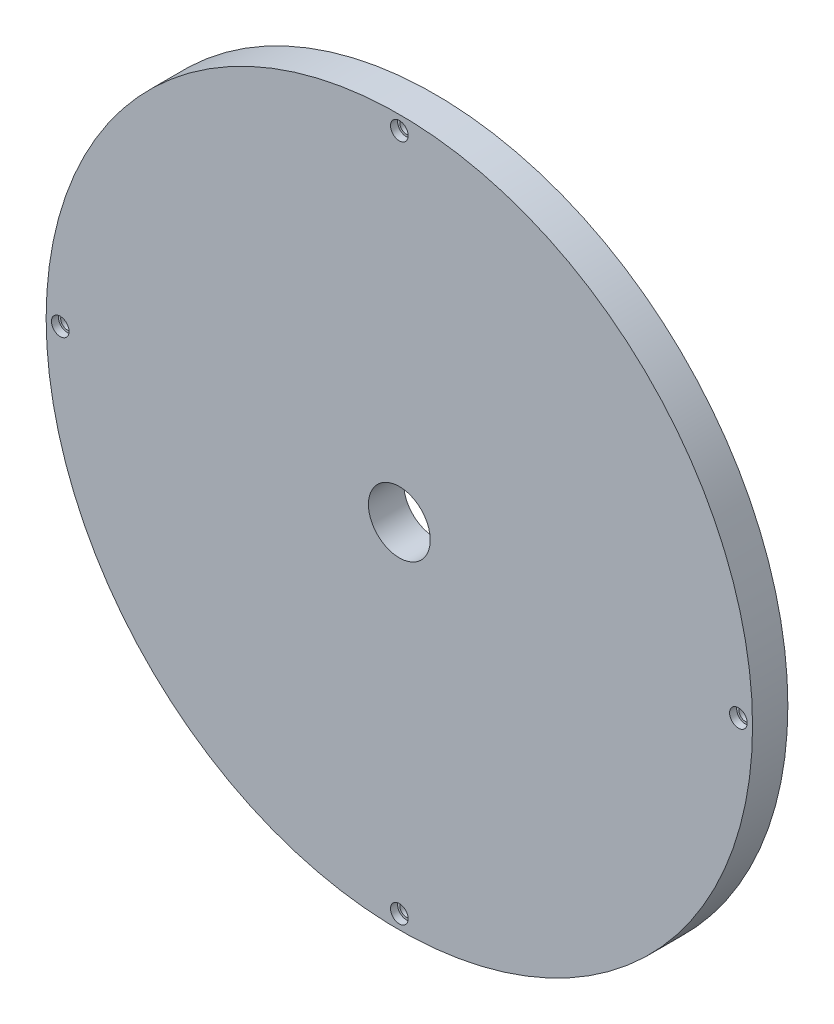
ISO-10303-21;
HEADER;
FILE_DESCRIPTION(('STEP AP214'),'2;1');
FILE_NAME('part.step','',(''),(''),'','','');
FILE_SCHEMA(('AUTOMOTIVE_DESIGN { 1 0 10303 214 1 1 1 1 }'));
ENDSEC;
DATA;
#1=APPLICATION_CONTEXT('core data for automotive mechanical design processes');
#2=APPLICATION_PROTOCOL_DEFINITION('international standard','automotive_design',2000,#1);
#3=PRODUCT_CONTEXT('',#1,'mechanical');
#4=PRODUCT('Part','Part','',(#3));
#5=PRODUCT_RELATED_PRODUCT_CATEGORY('part','',(#4));
#6=PRODUCT_DEFINITION_FORMATION('','',#4);
#7=PRODUCT_DEFINITION_CONTEXT('part definition',#1,'design');
#8=PRODUCT_DEFINITION('design','',#6,#7);
#9=PRODUCT_DEFINITION_SHAPE('','',#8);
#10=(LENGTH_UNIT() NAMED_UNIT(*) SI_UNIT(.MILLI.,.METRE.));
#11=(NAMED_UNIT(*) PLANE_ANGLE_UNIT() SI_UNIT($,.RADIAN.));
#12=(NAMED_UNIT(*) SI_UNIT($,.STERADIAN.) SOLID_ANGLE_UNIT());
#13=UNCERTAINTY_MEASURE_WITH_UNIT(LENGTH_MEASURE(1.E-05),#10,'distance_accuracy_value','');
#14=(GEOMETRIC_REPRESENTATION_CONTEXT(3) GLOBAL_UNCERTAINTY_ASSIGNED_CONTEXT((#13)) GLOBAL_UNIT_ASSIGNED_CONTEXT((#10,
#11,#12)) REPRESENTATION_CONTEXT('',''));
#15=CARTESIAN_POINT('',(0.,0.,0.));
#16=DIRECTION('',(0.,0.,1.));
#17=DIRECTION('',(1.,0.,0.));
#18=AXIS2_PLACEMENT_3D('',#15,#16,#17);
#19=CARTESIAN_POINT('',(-60.9600000000017,1.72512195998983E-12,6.35));
#20=DIRECTION('',(0.,0.,-1.));
#21=DIRECTION('',(-1.,0.,0.));
#22=AXIS2_PLACEMENT_3D('',#19,#20,#21);
#23=CYLINDRICAL_SURFACE('',#22,1.19062500000135);
#24=CARTESIAN_POINT('',(-60.9600000000017,1.72512195998983E-12,0.));
#25=DIRECTION('',(0.,0.,-1.));
#26=DIRECTION('',(-1.,0.,0.));
#27=AXIS2_PLACEMENT_3D('',#24,#25,#26);
#28=CIRCLE('',#27,1.19062500000135);
#29=CARTESIAN_POINT('',(-62.1506250000031,1.72512195998983E-12,0.));
#30=VERTEX_POINT('',#29);
#31=EDGE_CURVE('E89',#30,#30,#28,.T.);
#32=ORIENTED_EDGE('',*,*,#31,.T.);
#33=EDGE_LOOP('',(#32));
#34=FACE_BOUND('',#33,.T.);
#35=CARTESIAN_POINT('',(-60.9600000000017,1.72512195998983E-12,5.08));
#36=DIRECTION('',(0.,0.,1.));
#37=DIRECTION('',(1.,0.,0.));
#38=AXIS2_PLACEMENT_3D('',#35,#36,#37);
#39=CIRCLE('',#38,1.19062500000135);
#40=CARTESIAN_POINT('',(-59.7693750000004,1.72512195998983E-12,5.08));
#41=VERTEX_POINT('',#40);
#42=EDGE_CURVE('E35',#41,#41,#39,.F.);
#43=ORIENTED_EDGE('',*,*,#42,.F.);
#44=EDGE_LOOP('',(#43));
#45=FACE_BOUND('',#44,.T.);
#46=ADVANCED_FACE('F31',(#34,#45),#23,.F.);
#47=CARTESIAN_POINT('',(-3.45024391997965E-12,-60.96,6.35));
#48=DIRECTION('',(0.,0.,-1.));
#49=DIRECTION('',(-1.,0.,0.));
#50=AXIS2_PLACEMENT_3D('',#47,#48,#49);
#51=CYLINDRICAL_SURFACE('',#50,1.19062500000371);
#52=CARTESIAN_POINT('',(-3.45024391997965E-12,-60.96,0.));
#53=DIRECTION('',(0.,0.,-1.));
#54=DIRECTION('',(-1.,0.,0.));
#55=AXIS2_PLACEMENT_3D('',#52,#53,#54);
#56=CIRCLE('',#55,1.19062500000371);
#57=CARTESIAN_POINT('',(-1.19062500000716,-60.96,0.));
#58=VERTEX_POINT('',#57);
#59=EDGE_CURVE('E86',#58,#58,#56,.T.);
#60=ORIENTED_EDGE('',*,*,#59,.T.);
#61=EDGE_LOOP('',(#60));
#62=FACE_BOUND('',#61,.T.);
#63=CARTESIAN_POINT('',(-3.45024391997965E-12,-60.96,5.08));
#64=DIRECTION('',(0.,0.,1.));
#65=DIRECTION('',(1.,0.,0.));
#66=AXIS2_PLACEMENT_3D('',#63,#64,#65);
#67=CIRCLE('',#66,1.19062500000371);
#68=CARTESIAN_POINT('',(1.19062500000026,-60.96,5.08));
#69=VERTEX_POINT('',#68);
#70=EDGE_CURVE('E59',#69,#69,#67,.F.);
#71=ORIENTED_EDGE('',*,*,#70,.F.);
#72=EDGE_LOOP('',(#71));
#73=FACE_BOUND('',#72,.T.);
#74=ADVANCED_FACE('F129',(#62,#73),#51,.F.);
#75=CARTESIAN_POINT('',(60.9599999999983,-1.73258740687743E-12,6.35));
#76=DIRECTION('',(0.,0.,-1.));
#77=DIRECTION('',(-1.,0.,0.));
#78=AXIS2_PLACEMENT_3D('',#75,#76,#77);
#79=CYLINDRICAL_SURFACE('',#78,1.19062500000277);
#80=CARTESIAN_POINT('',(60.9599999999983,-1.73258740687743E-12,0.));
#81=DIRECTION('',(0.,0.,-1.));
#82=DIRECTION('',(-1.,0.,0.));
#83=AXIS2_PLACEMENT_3D('',#80,#81,#82);
#84=CIRCLE('',#83,1.19062500000277);
#85=CARTESIAN_POINT('',(59.7693749999955,-1.73258740687743E-12,0.));
#86=VERTEX_POINT('',#85);
#87=EDGE_CURVE('E53',#86,#86,#84,.T.);
#88=ORIENTED_EDGE('',*,*,#87,.T.);
#89=EDGE_LOOP('',(#88));
#90=FACE_BOUND('',#89,.T.);
#91=CARTESIAN_POINT('',(60.9599999999983,-1.73258740687743E-12,5.08));
#92=DIRECTION('',(0.,0.,1.));
#93=DIRECTION('',(1.,0.,0.));
#94=AXIS2_PLACEMENT_3D('',#91,#92,#93);
#95=CIRCLE('',#94,1.19062500000277);
#96=CARTESIAN_POINT('',(62.150625000001,-1.73258740687743E-12,5.08));
#97=VERTEX_POINT('',#96);
#98=EDGE_CURVE('E55',#97,#97,#95,.F.);
#99=ORIENTED_EDGE('',*,*,#98,.F.);
#100=EDGE_LOOP('',(#99));
#101=FACE_BOUND('',#100,.T.);
#102=ADVANCED_FACE('F125',(#90,#101),#79,.F.);
#103=CARTESIAN_POINT('',(0.,60.96,6.35));
#104=DIRECTION('',(0.,0.,-1.));
#105=DIRECTION('',(-1.,0.,0.));
#106=AXIS2_PLACEMENT_3D('',#103,#104,#105);
#107=CYLINDRICAL_SURFACE('',#106,1.190625);
#108=CARTESIAN_POINT('',(0.,60.96,0.));
#109=DIRECTION('',(0.,0.,-1.));
#110=DIRECTION('',(-1.,0.,0.));
#111=AXIS2_PLACEMENT_3D('',#108,#109,#110);
#112=CIRCLE('',#111,1.190625);
#113=CARTESIAN_POINT('',(-1.190625,60.96,0.));
#114=VERTEX_POINT('',#113);
#115=EDGE_CURVE('E92',#114,#114,#112,.T.);
#116=ORIENTED_EDGE('',*,*,#115,.T.);
#117=EDGE_LOOP('',(#116));
#118=FACE_BOUND('',#117,.T.);
#119=CARTESIAN_POINT('',(0.,60.96,5.08));
#120=DIRECTION('',(0.,0.,1.));
#121=DIRECTION('',(1.,0.,0.));
#122=AXIS2_PLACEMENT_3D('',#119,#120,#121);
#123=CIRCLE('',#122,1.190625);
#124=CARTESIAN_POINT('',(1.190625,60.96,5.08));
#125=VERTEX_POINT('',#124);
#126=EDGE_CURVE('E50',#125,#125,#123,.F.);
#127=ORIENTED_EDGE('',*,*,#126,.F.);
#128=EDGE_LOOP('',(#127));
#129=FACE_BOUND('',#128,.T.);
#130=ADVANCED_FACE('F117',(#118,#129),#107,.F.);
#131=CARTESIAN_POINT('',(0.,0.,6.35));
#132=DIRECTION('',(0.,0.,-1.));
#133=DIRECTION('',(-1.,0.,0.));
#134=AXIS2_PLACEMENT_3D('',#131,#132,#133);
#135=CYLINDRICAL_SURFACE('',#134,63.5);
#136=CARTESIAN_POINT('',(0.,0.,6.35));
#137=DIRECTION('',(0.,0.,1.));
#138=DIRECTION('',(1.,0.,0.));
#139=AXIS2_PLACEMENT_3D('',#136,#137,#138);
#140=CIRCLE('',#139,63.5);
#141=CARTESIAN_POINT('',(63.5,0.,6.35));
#142=VERTEX_POINT('',#141);
#143=EDGE_CURVE('E10',#142,#142,#140,.T.);
#144=ORIENTED_EDGE('',*,*,#143,.F.);
#145=EDGE_LOOP('',(#144));
#146=FACE_BOUND('',#145,.T.);
#147=CARTESIAN_POINT('',(0.,0.,0.));
#148=DIRECTION('',(0.,0.,1.));
#149=DIRECTION('',(1.,0.,0.));
#150=AXIS2_PLACEMENT_3D('',#147,#148,#149);
#151=CIRCLE('',#150,63.5);
#152=CARTESIAN_POINT('',(63.5,0.,0.));
#153=VERTEX_POINT('',#152);
#154=EDGE_CURVE('E39',#153,#153,#151,.T.);
#155=ORIENTED_EDGE('',*,*,#154,.T.);
#156=EDGE_LOOP('',(#155));
#157=FACE_BOUND('',#156,.T.);
#158=ADVANCED_FACE('F33',(#146,#157),#135,.T.);
#159=CARTESIAN_POINT('',(0.,0.,6.35));
#160=DIRECTION('',(0.,0.,1.));
#161=DIRECTION('',(1.,0.,0.));
#162=AXIS2_PLACEMENT_3D('',#159,#160,#161);
#163=PLANE('',#162);
#164=CARTESIAN_POINT('',(0.,0.,6.35));
#165=DIRECTION('',(0.,0.,-1.));
#166=DIRECTION('',(-1.,0.,0.));
#167=AXIS2_PLACEMENT_3D('',#164,#165,#166);
#168=CIRCLE('',#167,5.55625);
#169=CARTESIAN_POINT('',(-5.55625,0.,6.35));
#170=VERTEX_POINT('',#169);
#171=EDGE_CURVE('E322',#170,#170,#168,.T.);
#172=ORIENTED_EDGE('',*,*,#171,.T.);
#173=EDGE_LOOP('',(#172));
#174=FACE_BOUND('',#173,.T.);
#175=CARTESIAN_POINT('',(-60.9599999999983,-1.73258740687743E-12,6.35));
#176=DIRECTION('',(0.,0.,1.));
#177=DIRECTION('',(1.,0.,0.));
#178=AXIS2_PLACEMENT_3D('',#175,#176,#177);
#179=CIRCLE('',#178,1.58750000000277);
#180=CARTESIAN_POINT('',(-59.3724999999955,-1.73258740687743E-12,6.35));
#181=VERTEX_POINT('',#180);
#182=EDGE_CURVE('E75',#181,#181,#179,.T.);
#183=ORIENTED_EDGE('',*,*,#182,.F.);
#184=EDGE_LOOP('',(#183));
#185=FACE_BOUND('',#184,.T.);
#186=CARTESIAN_POINT('',(3.45024391997965E-12,-60.96,6.35));
#187=DIRECTION('',(0.,0.,1.));
#188=DIRECTION('',(1.,0.,0.));
#189=AXIS2_PLACEMENT_3D('',#186,#187,#188);
#190=CIRCLE('',#189,1.5875000000037);
#191=CARTESIAN_POINT('',(1.58750000000716,-60.96,6.35));
#192=VERTEX_POINT('',#191);
#193=EDGE_CURVE('E68',#192,#192,#190,.T.);
#194=ORIENTED_EDGE('',*,*,#193,.F.);
#195=EDGE_LOOP('',(#194));
#196=FACE_BOUND('',#195,.T.);
#197=CARTESIAN_POINT('',(60.9600000000017,1.72512195998983E-12,6.35));
#198=DIRECTION('',(0.,0.,1.));
#199=DIRECTION('',(1.,0.,0.));
#200=AXIS2_PLACEMENT_3D('',#197,#198,#199);
#201=CIRCLE('',#200,1.58750000000135);
#202=CARTESIAN_POINT('',(62.5475000000031,1.72512195998983E-12,6.35));
#203=VERTEX_POINT('',#202);
#204=EDGE_CURVE('E61',#203,#203,#201,.T.);
#205=ORIENTED_EDGE('',*,*,#204,.F.);
#206=EDGE_LOOP('',(#205));
#207=FACE_BOUND('',#206,.T.);
#208=CARTESIAN_POINT('',(0.,60.96,6.35));
#209=DIRECTION('',(0.,0.,1.));
#210=DIRECTION('',(1.,0.,0.));
#211=AXIS2_PLACEMENT_3D('',#208,#209,#210);
#212=CIRCLE('',#211,1.5875);
#213=CARTESIAN_POINT('',(1.5875,60.96,6.35));
#214=VERTEX_POINT('',#213);
#215=EDGE_CURVE('E57',#214,#214,#212,.T.);
#216=ORIENTED_EDGE('',*,*,#215,.F.);
#217=EDGE_LOOP('',(#216));
#218=FACE_BOUND('',#217,.T.);
#219=ORIENTED_EDGE('',*,*,#143,.T.);
#220=EDGE_LOOP('',(#219));
#221=FACE_BOUND('',#220,.T.);
#222=ADVANCED_FACE('F111',(#174,#185,#196,#207,#218,#221),#163,.T.);
#223=CARTESIAN_POINT('',(0.,0.,0.));
#224=DIRECTION('',(0.,0.,1.));
#225=DIRECTION('',(1.,0.,0.));
#226=AXIS2_PLACEMENT_3D('',#223,#224,#225);
#227=PLANE('',#226);
#228=ORIENTED_EDGE('',*,*,#87,.F.);
#229=EDGE_LOOP('',(#228));
#230=FACE_BOUND('',#229,.T.);
#231=ORIENTED_EDGE('',*,*,#59,.F.);
#232=EDGE_LOOP('',(#231));
#233=FACE_BOUND('',#232,.T.);
#234=ORIENTED_EDGE('',*,*,#31,.F.);
#235=EDGE_LOOP('',(#234));
#236=FACE_BOUND('',#235,.T.);
#237=ORIENTED_EDGE('',*,*,#115,.F.);
#238=EDGE_LOOP('',(#237));
#239=FACE_BOUND('',#238,.T.);
#240=CARTESIAN_POINT('',(0.,0.,0.));
#241=DIRECTION('',(0.,0.,-1.));
#242=DIRECTION('',(-1.,0.,0.));
#243=AXIS2_PLACEMENT_3D('',#240,#241,#242);
#244=CIRCLE('',#243,57.15);
#245=CARTESIAN_POINT('',(-57.15,0.,0.));
#246=VERTEX_POINT('',#245);
#247=EDGE_CURVE('E47',#246,#246,#244,.T.);
#248=ORIENTED_EDGE('',*,*,#247,.F.);
#249=EDGE_LOOP('',(#248));
#250=FACE_BOUND('',#249,.T.);
#251=ORIENTED_EDGE('',*,*,#154,.F.);
#252=EDGE_LOOP('',(#251));
#253=FACE_BOUND('',#252,.T.);
#254=ADVANCED_FACE('F108',(#230,#233,#236,#239,#250,#253),#227,.F.);
#255=CARTESIAN_POINT('',(0.,0.,1.27));
#256=DIRECTION('',(0.,0.,-1.));
#257=DIRECTION('',(-1.,0.,0.));
#258=AXIS2_PLACEMENT_3D('',#255,#256,#257);
#259=CYLINDRICAL_SURFACE('',#258,57.15);
#260=CARTESIAN_POINT('',(0.,0.,1.27));
#261=DIRECTION('',(0.,0.,-1.));
#262=DIRECTION('',(-1.,0.,0.));
#263=AXIS2_PLACEMENT_3D('',#260,#261,#262);
#264=CIRCLE('',#263,57.15);
#265=CARTESIAN_POINT('',(-57.15,0.,1.27));
#266=VERTEX_POINT('',#265);
#267=EDGE_CURVE('E44',#266,#266,#264,.T.);
#268=ORIENTED_EDGE('',*,*,#267,.F.);
#269=EDGE_LOOP('',(#268));
#270=FACE_BOUND('',#269,.T.);
#271=ORIENTED_EDGE('',*,*,#247,.T.);
#272=EDGE_LOOP('',(#271));
#273=FACE_BOUND('',#272,.T.);
#274=ADVANCED_FACE('F106',(#270,#273),#259,.F.);
#275=CARTESIAN_POINT('',(0.,0.,1.27));
#276=DIRECTION('',(0.,0.,-1.));
#277=DIRECTION('',(-1.,0.,0.));
#278=AXIS2_PLACEMENT_3D('',#275,#276,#277);
#279=PLANE('',#278);
#280=CARTESIAN_POINT('',(0.,0.,1.27));
#281=DIRECTION('',(0.,0.,-1.));
#282=DIRECTION('',(-1.,0.,0.));
#283=AXIS2_PLACEMENT_3D('',#280,#281,#282);
#284=CIRCLE('',#283,50.8);
#285=CARTESIAN_POINT('',(-50.8,0.,1.27));
#286=VERTEX_POINT('',#285);
#287=EDGE_CURVE('E96',#286,#286,#284,.T.);
#288=ORIENTED_EDGE('',*,*,#287,.F.);
#289=EDGE_LOOP('',(#288));
#290=FACE_BOUND('',#289,.T.);
#291=ORIENTED_EDGE('',*,*,#267,.T.);
#292=EDGE_LOOP('',(#291));
#293=FACE_BOUND('',#292,.T.);
#294=ADVANCED_FACE('F143',(#290,#293),#279,.T.);
#295=CARTESIAN_POINT('',(0.,0.,1.27));
#296=DIRECTION('',(0.,0.,-1.));
#297=DIRECTION('',(-1.,0.,0.));
#298=AXIS2_PLACEMENT_3D('',#295,#296,#297);
#299=CYLINDRICAL_SURFACE('',#298,50.8);
#300=ORIENTED_EDGE('',*,*,#287,.T.);
#301=EDGE_LOOP('',(#300));
#302=FACE_BOUND('',#301,.T.);
#303=CARTESIAN_POINT('',(0.,0.,0.));
#304=DIRECTION('',(0.,0.,-1.));
#305=DIRECTION('',(-1.,0.,0.));
#306=AXIS2_PLACEMENT_3D('',#303,#304,#305);
#307=CIRCLE('',#306,50.8);
#308=CARTESIAN_POINT('',(-50.8,0.,0.));
#309=VERTEX_POINT('',#308);
#310=EDGE_CURVE('E95',#309,#309,#307,.T.);
#311=ORIENTED_EDGE('',*,*,#310,.F.);
#312=EDGE_LOOP('',(#311));
#313=FACE_BOUND('',#312,.T.);
#314=ADVANCED_FACE('F140',(#302,#313),#299,.T.);
#315=CARTESIAN_POINT('',(0.,0.,0.));
#316=DIRECTION('',(0.,0.,-1.));
#317=DIRECTION('',(-1.,0.,0.));
#318=AXIS2_PLACEMENT_3D('',#315,#316,#317);
#319=CIRCLE('',#318,5.55625);
#320=CARTESIAN_POINT('',(-5.55625,0.,0.));
#321=VERTEX_POINT('',#320);
#322=EDGE_CURVE('E325',#321,#321,#319,.T.);
#323=ORIENTED_EDGE('',*,*,#322,.F.);
#324=EDGE_LOOP('',(#323));
#325=FACE_BOUND('',#324,.T.);
#326=ORIENTED_EDGE('',*,*,#310,.T.);
#327=EDGE_LOOP('',(#326));
#328=FACE_BOUND('',#327,.T.);
#329=ADVANCED_FACE('F113',(#325,#328),#227,.F.);
#330=CARTESIAN_POINT('',(0.,60.96,5.08));
#331=DIRECTION('',(0.,0.,1.));
#332=DIRECTION('',(1.,0.,0.));
#333=AXIS2_PLACEMENT_3D('',#330,#331,#332);
#334=PLANE('',#333);
#335=CARTESIAN_POINT('',(0.,60.96,5.08));
#336=DIRECTION('',(0.,0.,1.));
#337=DIRECTION('',(1.,0.,0.));
#338=AXIS2_PLACEMENT_3D('',#335,#336,#337);
#339=CIRCLE('',#338,1.5875);
#340=CARTESIAN_POINT('',(1.5875,60.96,5.08));
#341=VERTEX_POINT('',#340);
#342=EDGE_CURVE('E54',#341,#341,#339,.T.);
#343=ORIENTED_EDGE('',*,*,#342,.T.);
#344=EDGE_LOOP('',(#343));
#345=FACE_BOUND('',#344,.T.);
#346=ORIENTED_EDGE('',*,*,#126,.T.);
#347=EDGE_LOOP('',(#346));
#348=FACE_BOUND('',#347,.T.);
#349=ADVANCED_FACE('F168',(#345,#348),#334,.T.);
#350=CARTESIAN_POINT('',(0.,60.96,5.08));
#351=DIRECTION('',(0.,0.,1.));
#352=DIRECTION('',(1.,0.,0.));
#353=AXIS2_PLACEMENT_3D('',#350,#351,#352);
#354=CYLINDRICAL_SURFACE('',#353,1.5875);
#355=ORIENTED_EDGE('',*,*,#342,.F.);
#356=EDGE_LOOP('',(#355));
#357=FACE_BOUND('',#356,.T.);
#358=ORIENTED_EDGE('',*,*,#215,.T.);
#359=EDGE_LOOP('',(#358));
#360=FACE_BOUND('',#359,.T.);
#361=ADVANCED_FACE('F177',(#357,#360),#354,.F.);
#362=CARTESIAN_POINT('',(60.9600000000017,1.72512195998983E-12,5.08));
#363=DIRECTION('',(0.,0.,1.));
#364=DIRECTION('',(1.,0.,0.));
#365=AXIS2_PLACEMENT_3D('',#362,#363,#364);
#366=PLANE('',#365);
#367=CARTESIAN_POINT('',(60.9600000000017,1.72512195998983E-12,5.08));
#368=DIRECTION('',(0.,0.,1.));
#369=DIRECTION('',(1.,0.,0.));
#370=AXIS2_PLACEMENT_3D('',#367,#368,#369);
#371=CIRCLE('',#370,1.58750000000135);
#372=CARTESIAN_POINT('',(62.5475000000031,1.72512195998983E-12,5.08));
#373=VERTEX_POINT('',#372);
#374=EDGE_CURVE('E58',#373,#373,#371,.T.);
#375=ORIENTED_EDGE('',*,*,#374,.T.);
#376=EDGE_LOOP('',(#375));
#377=FACE_BOUND('',#376,.T.);
#378=ORIENTED_EDGE('',*,*,#98,.T.);
#379=EDGE_LOOP('',(#378));
#380=FACE_BOUND('',#379,.T.);
#381=ADVANCED_FACE('F186',(#377,#380),#366,.T.);
#382=CARTESIAN_POINT('',(60.9600000000017,1.72512195998983E-12,5.08));
#383=DIRECTION('',(0.,0.,1.));
#384=DIRECTION('',(1.,0.,0.));
#385=AXIS2_PLACEMENT_3D('',#382,#383,#384);
#386=CYLINDRICAL_SURFACE('',#385,1.58750000000135);
#387=ORIENTED_EDGE('',*,*,#374,.F.);
#388=EDGE_LOOP('',(#387));
#389=FACE_BOUND('',#388,.T.);
#390=ORIENTED_EDGE('',*,*,#204,.T.);
#391=EDGE_LOOP('',(#390));
#392=FACE_BOUND('',#391,.T.);
#393=ADVANCED_FACE('F194',(#389,#392),#386,.F.);
#394=CARTESIAN_POINT('',(3.45024391997965E-12,-60.96,5.08));
#395=DIRECTION('',(0.,0.,1.));
#396=DIRECTION('',(1.,0.,0.));
#397=AXIS2_PLACEMENT_3D('',#394,#395,#396);
#398=PLANE('',#397);
#399=CARTESIAN_POINT('',(3.45024391997965E-12,-60.96,5.08));
#400=DIRECTION('',(0.,0.,1.));
#401=DIRECTION('',(1.,0.,0.));
#402=AXIS2_PLACEMENT_3D('',#399,#400,#401);
#403=CIRCLE('',#402,1.5875000000037);
#404=CARTESIAN_POINT('',(1.58750000000716,-60.96,5.08));
#405=VERTEX_POINT('',#404);
#406=EDGE_CURVE('E62',#405,#405,#403,.T.);
#407=ORIENTED_EDGE('',*,*,#406,.T.);
#408=EDGE_LOOP('',(#407));
#409=FACE_BOUND('',#408,.T.);
#410=ORIENTED_EDGE('',*,*,#70,.T.);
#411=EDGE_LOOP('',(#410));
#412=FACE_BOUND('',#411,.T.);
#413=ADVANCED_FACE('F202',(#409,#412),#398,.T.);
#414=CARTESIAN_POINT('',(3.45024391997965E-12,-60.96,5.08));
#415=DIRECTION('',(0.,0.,1.));
#416=DIRECTION('',(1.,0.,0.));
#417=AXIS2_PLACEMENT_3D('',#414,#415,#416);
#418=CYLINDRICAL_SURFACE('',#417,1.5875000000037);
#419=ORIENTED_EDGE('',*,*,#406,.F.);
#420=EDGE_LOOP('',(#419));
#421=FACE_BOUND('',#420,.T.);
#422=ORIENTED_EDGE('',*,*,#193,.T.);
#423=EDGE_LOOP('',(#422));
#424=FACE_BOUND('',#423,.T.);
#425=ADVANCED_FACE('F210',(#421,#424),#418,.F.);
#426=CARTESIAN_POINT('',(-60.9599999999983,-1.73258740687743E-12,5.08));
#427=DIRECTION('',(0.,0.,1.));
#428=DIRECTION('',(1.,0.,0.));
#429=AXIS2_PLACEMENT_3D('',#426,#427,#428);
#430=PLANE('',#429);
#431=CARTESIAN_POINT('',(-60.9599999999983,-1.73258740687743E-12,5.08));
#432=DIRECTION('',(0.,0.,1.));
#433=DIRECTION('',(1.,0.,0.));
#434=AXIS2_PLACEMENT_3D('',#431,#432,#433);
#435=CIRCLE('',#434,1.58750000000277);
#436=CARTESIAN_POINT('',(-59.3724999999955,-1.73258740687743E-12,5.08));
#437=VERTEX_POINT('',#436);
#438=EDGE_CURVE('E328',#437,#437,#435,.T.);
#439=ORIENTED_EDGE('',*,*,#438,.T.);
#440=EDGE_LOOP('',(#439));
#441=FACE_BOUND('',#440,.T.);
#442=ORIENTED_EDGE('',*,*,#42,.T.);
#443=EDGE_LOOP('',(#442));
#444=FACE_BOUND('',#443,.T.);
#445=ADVANCED_FACE('F217',(#441,#444),#430,.T.);
#446=CARTESIAN_POINT('',(-60.9599999999983,-1.73258740687743E-12,5.08));
#447=DIRECTION('',(0.,0.,1.));
#448=DIRECTION('',(1.,0.,0.));
#449=AXIS2_PLACEMENT_3D('',#446,#447,#448);
#450=CYLINDRICAL_SURFACE('',#449,1.58750000000277);
#451=ORIENTED_EDGE('',*,*,#438,.F.);
#452=EDGE_LOOP('',(#451));
#453=FACE_BOUND('',#452,.T.);
#454=ORIENTED_EDGE('',*,*,#182,.T.);
#455=EDGE_LOOP('',(#454));
#456=FACE_BOUND('',#455,.T.);
#457=ADVANCED_FACE('F225',(#453,#456),#450,.F.);
#458=CARTESIAN_POINT('',(0.,0.,6.35));
#459=DIRECTION('',(0.,0.,-1.));
#460=DIRECTION('',(-1.,0.,0.));
#461=AXIS2_PLACEMENT_3D('',#458,#459,#460);
#462=CYLINDRICAL_SURFACE('',#461,5.55625);
#463=ORIENTED_EDGE('',*,*,#171,.F.);
#464=EDGE_LOOP('',(#463));
#465=FACE_BOUND('',#464,.T.);
#466=ORIENTED_EDGE('',*,*,#322,.T.);
#467=EDGE_LOOP('',(#466));
#468=FACE_BOUND('',#467,.T.);
#469=ADVANCED_FACE('F233',(#465,#468),#462,.F.);
#470=CLOSED_SHELL('',(#46,#74,#102,#130,#158,#222,#254,#274,#294,#314,#329,#349,#361,#381,#393,
#413,#425,#445,#457,#469));
#471=MANIFOLD_SOLID_BREP('B2',#470);
#472=ADVANCED_BREP_SHAPE_REPRESENTATION('',(#18,#471),#14);
#473=SHAPE_DEFINITION_REPRESENTATION(#9,#472);
ENDSEC;
END-ISO-10303-21;
